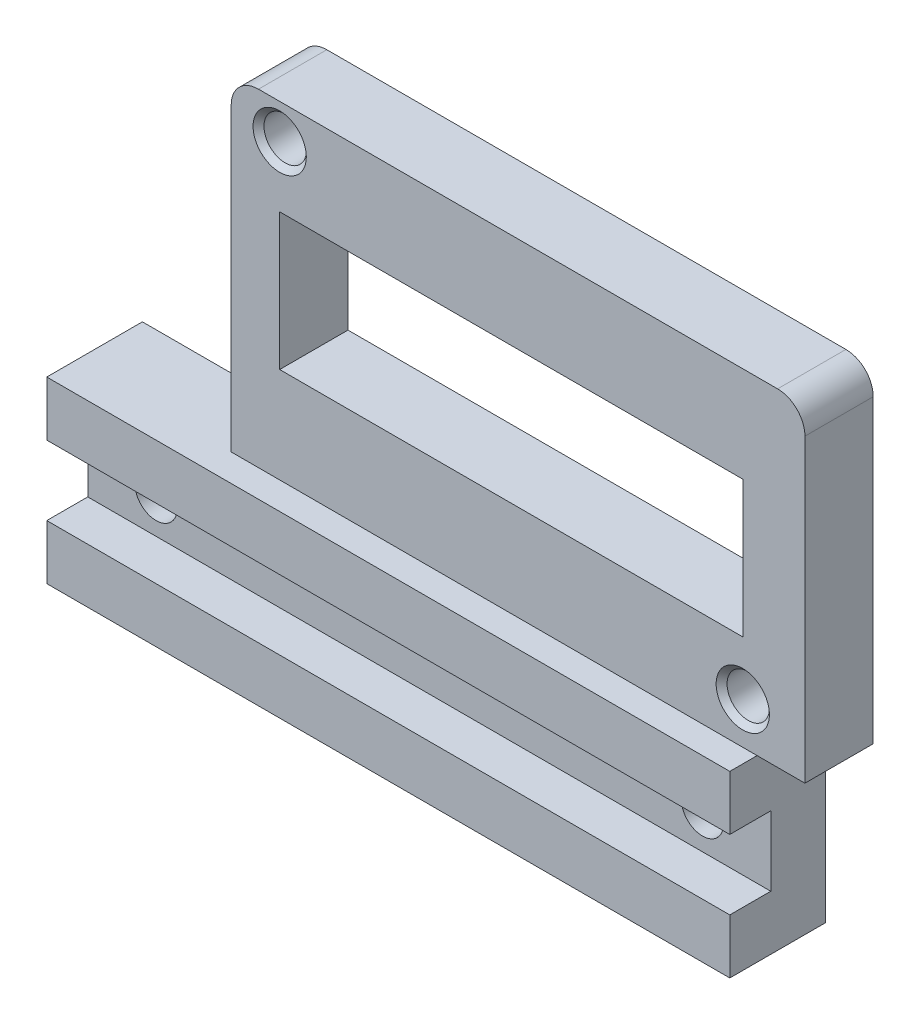
ISO-10303-21;
HEADER;
FILE_DESCRIPTION(('STEP AP214'),'2;1');
FILE_NAME('part.step','',(''),(''),'','','');
FILE_SCHEMA(('AUTOMOTIVE_DESIGN { 1 0 10303 214 1 1 1 1 }'));
ENDSEC;
DATA;
#1=APPLICATION_CONTEXT('core data for automotive mechanical design processes');
#2=APPLICATION_PROTOCOL_DEFINITION('international standard','automotive_design',2000,#1);
#3=PRODUCT_CONTEXT('',#1,'mechanical');
#4=PRODUCT('Part','Part','',(#3));
#5=PRODUCT_RELATED_PRODUCT_CATEGORY('part','',(#4));
#6=PRODUCT_DEFINITION_FORMATION('','',#4);
#7=PRODUCT_DEFINITION_CONTEXT('part definition',#1,'design');
#8=PRODUCT_DEFINITION('design','',#6,#7);
#9=PRODUCT_DEFINITION_SHAPE('','',#8);
#10=(LENGTH_UNIT() NAMED_UNIT(*) SI_UNIT(.MILLI.,.METRE.));
#11=(NAMED_UNIT(*) PLANE_ANGLE_UNIT() SI_UNIT($,.RADIAN.));
#12=(NAMED_UNIT(*) SI_UNIT($,.STERADIAN.) SOLID_ANGLE_UNIT());
#13=UNCERTAINTY_MEASURE_WITH_UNIT(LENGTH_MEASURE(1.E-05),#10,'distance_accuracy_value','');
#14=(GEOMETRIC_REPRESENTATION_CONTEXT(3) GLOBAL_UNCERTAINTY_ASSIGNED_CONTEXT((#13)) GLOBAL_UNIT_ASSIGNED_CONTEXT((#10,
#11,#12)) REPRESENTATION_CONTEXT('',''));
#15=CARTESIAN_POINT('',(0.,0.,0.));
#16=DIRECTION('',(0.,0.,1.));
#17=DIRECTION('',(1.,0.,0.));
#18=AXIS2_PLACEMENT_3D('',#15,#16,#17);
#19=CARTESIAN_POINT('',(-25.,6.55,7.));
#20=DIRECTION('',(0.,-1.,0.));
#21=DIRECTION('',(0.,0.,-1.));
#22=AXIS2_PLACEMENT_3D('',#19,#20,#21);
#23=PLANE('',#22);
#24=DIRECTION('',(1.,0.,0.));
#25=VECTOR('',#24,1.);
#26=CARTESIAN_POINT('',(0.,6.55,5.));
#27=LINE('',#26,#25);
#28=CARTESIAN_POINT('',(-13.5,6.55,5.));
#29=VERTEX_POINT('',#28);
#30=CARTESIAN_POINT('',(25.,6.55,5.));
#31=VERTEX_POINT('',#30);
#32=EDGE_CURVE('E300',#29,#31,#27,.T.);
#33=ORIENTED_EDGE('',*,*,#32,.F.);
#34=DIRECTION('',(0.,0.,-1.));
#35=VECTOR('',#34,1.);
#36=CARTESIAN_POINT('',(-13.5,6.55,5.));
#37=LINE('',#36,#35);
#38=CARTESIAN_POINT('',(-13.5,6.55,0.));
#39=VERTEX_POINT('',#38);
#40=EDGE_CURVE('E319',#29,#39,#37,.T.);
#41=ORIENTED_EDGE('',*,*,#40,.T.);
#42=DIRECTION('',(-1.,0.,0.));
#43=VECTOR('',#42,1.);
#44=CARTESIAN_POINT('',(-25.,6.55,0.));
#45=LINE('',#44,#43);
#46=CARTESIAN_POINT('',(-25.,6.55,0.));
#47=VERTEX_POINT('',#46);
#48=EDGE_CURVE('E332',#39,#47,#45,.T.);
#49=ORIENTED_EDGE('',*,*,#48,.T.);
#50=DIRECTION('',(0.,0.,-1.));
#51=VECTOR('',#50,1.);
#52=CARTESIAN_POINT('',(-25.,6.55,7.));
#53=LINE('',#52,#51);
#54=CARTESIAN_POINT('',(-25.,6.55,7.));
#55=VERTEX_POINT('',#54);
#56=EDGE_CURVE('E341',#55,#47,#53,.T.);
#57=ORIENTED_EDGE('',*,*,#56,.F.);
#58=DIRECTION('',(-1.,0.,0.));
#59=VECTOR('',#58,1.);
#60=CARTESIAN_POINT('',(-25.,6.55,7.));
#61=LINE('',#60,#59);
#62=CARTESIAN_POINT('',(25.,6.55,7.));
#63=VERTEX_POINT('',#62);
#64=EDGE_CURVE('E338',#63,#55,#61,.T.);
#65=ORIENTED_EDGE('',*,*,#64,.F.);
#66=DIRECTION('',(0.,0.,-1.));
#67=VECTOR('',#66,1.);
#68=CARTESIAN_POINT('',(25.,6.55,7.));
#69=LINE('',#68,#67);
#70=EDGE_CURVE('E349',#63,#31,#69,.T.);
#71=ORIENTED_EDGE('',*,*,#70,.T.);
#72=EDGE_LOOP('',(#33,#41,#49,#57,#65,#71));
#73=FACE_BOUND('',#72,.T.);
#74=ADVANCED_FACE('F103',(#73),#23,.F.);
#75=CARTESIAN_POINT('',(25.,0.,4.));
#76=DIRECTION('',(1.,0.,0.));
#77=DIRECTION('',(0.,0.,-1.));
#78=AXIS2_PLACEMENT_3D('',#75,#76,#77);
#79=PLANE('',#78);
#80=DIRECTION('',(0.,-1.,0.));
#81=VECTOR('',#80,1.);
#82=CARTESIAN_POINT('',(25.,0.,0.));
#83=LINE('',#82,#81);
#84=CARTESIAN_POINT('',(25.,6.55,0.));
#85=VERTEX_POINT('',#84);
#86=CARTESIAN_POINT('',(25.,-6.55,0.));
#87=VERTEX_POINT('',#86);
#88=EDGE_CURVE('E360',#85,#87,#83,.T.);
#89=ORIENTED_EDGE('',*,*,#88,.F.);
#90=EDGE_CURVE('E348',#31,#85,#69,.T.);
#91=ORIENTED_EDGE('',*,*,#90,.F.);
#92=ORIENTED_EDGE('',*,*,#70,.F.);
#93=DIRECTION('',(0.,1.,0.));
#94=VECTOR('',#93,1.);
#95=CARTESIAN_POINT('',(25.,2.55,7.));
#96=LINE('',#95,#94);
#97=CARTESIAN_POINT('',(25.,2.55,7.));
#98=VERTEX_POINT('',#97);
#99=EDGE_CURVE('E335',#98,#63,#96,.T.);
#100=ORIENTED_EDGE('',*,*,#99,.F.);
#101=DIRECTION('',(0.,0.,-1.));
#102=VECTOR('',#101,1.);
#103=CARTESIAN_POINT('',(25.,2.55,7.));
#104=LINE('',#103,#102);
#105=CARTESIAN_POINT('',(25.,2.55,4.));
#106=VERTEX_POINT('',#105);
#107=EDGE_CURVE('E353',#98,#106,#104,.T.);
#108=ORIENTED_EDGE('',*,*,#107,.T.);
#109=DIRECTION('',(0.,-1.,0.));
#110=VECTOR('',#109,1.);
#111=CARTESIAN_POINT('',(25.,0.,4.));
#112=LINE('',#111,#110);
#113=CARTESIAN_POINT('',(25.,-2.55,4.));
#114=VERTEX_POINT('',#113);
#115=EDGE_CURVE('E395',#106,#114,#112,.T.);
#116=ORIENTED_EDGE('',*,*,#115,.T.);
#117=DIRECTION('',(0.,0.,-1.));
#118=VECTOR('',#117,1.);
#119=CARTESIAN_POINT('',(25.,-2.55,7.));
#120=LINE('',#119,#118);
#121=CARTESIAN_POINT('',(25.,-2.55,7.));
#122=VERTEX_POINT('',#121);
#123=EDGE_CURVE('E368',#122,#114,#120,.T.);
#124=ORIENTED_EDGE('',*,*,#123,.F.);
#125=DIRECTION('',(0.,1.,0.));
#126=VECTOR('',#125,1.);
#127=CARTESIAN_POINT('',(25.,-2.55,7.));
#128=LINE('',#127,#126);
#129=CARTESIAN_POINT('',(25.,-6.55,7.));
#130=VERTEX_POINT('',#129);
#131=EDGE_CURVE('E382',#130,#122,#128,.T.);
#132=ORIENTED_EDGE('',*,*,#131,.F.);
#133=DIRECTION('',(0.,0.,-1.));
#134=VECTOR('',#133,1.);
#135=CARTESIAN_POINT('',(25.,-6.55,7.));
#136=LINE('',#135,#134);
#137=EDGE_CURVE('E364',#130,#87,#136,.T.);
#138=ORIENTED_EDGE('',*,*,#137,.T.);
#139=EDGE_LOOP('',(#89,#91,#92,#100,#108,#116,#124,#132,#138));
#140=FACE_BOUND('',#139,.T.);
#141=ADVANCED_FACE('F501',(#140),#79,.T.);
#142=CARTESIAN_POINT('',(-20.,0.,4.));
#143=DIRECTION('',(0.,0.,-1.));
#144=DIRECTION('',(-1.,0.,0.));
#145=AXIS2_PLACEMENT_3D('',#142,#143,#144);
#146=CYLINDRICAL_SURFACE('',#145,1.55);
#147=CARTESIAN_POINT('',(-20.,0.,4.));
#148=DIRECTION('',(0.,0.,1.));
#149=DIRECTION('',(1.,0.,0.));
#150=AXIS2_PLACEMENT_3D('',#147,#148,#149);
#151=CIRCLE('',#150,1.55);
#152=CARTESIAN_POINT('',(-18.45,0.,4.));
#153=VERTEX_POINT('',#152);
#154=EDGE_CURVE('E408',#153,#153,#151,.T.);
#155=ORIENTED_EDGE('',*,*,#154,.T.);
#156=EDGE_LOOP('',(#155));
#157=FACE_BOUND('',#156,.T.);
#158=CARTESIAN_POINT('',(-20.,0.,0.));
#159=DIRECTION('',(0.,0.,1.));
#160=DIRECTION('',(1.,0.,0.));
#161=AXIS2_PLACEMENT_3D('',#158,#159,#160);
#162=CIRCLE('',#161,1.55);
#163=CARTESIAN_POINT('',(-18.45,0.,0.));
#164=VERTEX_POINT('',#163);
#165=EDGE_CURVE('E422',#164,#164,#162,.T.);
#166=ORIENTED_EDGE('',*,*,#165,.F.);
#167=EDGE_LOOP('',(#166));
#168=FACE_BOUND('',#167,.T.);
#169=ADVANCED_FACE('F508',(#157,#168),#146,.F.);
#170=CARTESIAN_POINT('',(-25.,0.,4.));
#171=DIRECTION('',(1.,0.,0.));
#172=DIRECTION('',(0.,0.,-1.));
#173=AXIS2_PLACEMENT_3D('',#170,#171,#172);
#174=PLANE('',#173);
#175=DIRECTION('',(0.,-1.,0.));
#176=VECTOR('',#175,1.);
#177=CARTESIAN_POINT('',(-25.,0.,0.));
#178=LINE('',#177,#176);
#179=CARTESIAN_POINT('',(-25.,-6.55,0.));
#180=VERTEX_POINT('',#179);
#181=EDGE_CURVE('E419',#47,#180,#178,.T.);
#182=ORIENTED_EDGE('',*,*,#181,.T.);
#183=DIRECTION('',(0.,0.,-1.));
#184=VECTOR('',#183,1.);
#185=CARTESIAN_POINT('',(-25.,-6.55,7.));
#186=LINE('',#185,#184);
#187=CARTESIAN_POINT('',(-25.,-6.55,7.));
#188=VERTEX_POINT('',#187);
#189=EDGE_CURVE('E323',#188,#180,#186,.T.);
#190=ORIENTED_EDGE('',*,*,#189,.F.);
#191=DIRECTION('',(0.,-1.,0.));
#192=VECTOR('',#191,1.);
#193=CARTESIAN_POINT('',(-25.,-2.55,7.));
#194=LINE('',#193,#192);
#195=CARTESIAN_POINT('',(-25.,-2.55,7.));
#196=VERTEX_POINT('',#195);
#197=EDGE_CURVE('E379',#196,#188,#194,.T.);
#198=ORIENTED_EDGE('',*,*,#197,.F.);
#199=DIRECTION('',(0.,0.,-1.));
#200=VECTOR('',#199,1.);
#201=CARTESIAN_POINT('',(-25.,-2.55,7.));
#202=LINE('',#201,#200);
#203=CARTESIAN_POINT('',(-25.,-2.55,4.));
#204=VERTEX_POINT('',#203);
#205=EDGE_CURVE('E371',#196,#204,#202,.T.);
#206=ORIENTED_EDGE('',*,*,#205,.T.);
#207=DIRECTION('',(0.,-1.,0.));
#208=VECTOR('',#207,1.);
#209=CARTESIAN_POINT('',(-25.,0.,4.));
#210=LINE('',#209,#208);
#211=CARTESIAN_POINT('',(-25.,2.55,4.));
#212=VERTEX_POINT('',#211);
#213=EDGE_CURVE('E404',#212,#204,#210,.T.);
#214=ORIENTED_EDGE('',*,*,#213,.F.);
#215=DIRECTION('',(0.,0.,-1.));
#216=VECTOR('',#215,1.);
#217=CARTESIAN_POINT('',(-25.,2.55,7.));
#218=LINE('',#217,#216);
#219=CARTESIAN_POINT('',(-25.,2.55,7.));
#220=VERTEX_POINT('',#219);
#221=EDGE_CURVE('E357',#220,#212,#218,.T.);
#222=ORIENTED_EDGE('',*,*,#221,.F.);
#223=DIRECTION('',(0.,-1.,0.));
#224=VECTOR('',#223,1.);
#225=CARTESIAN_POINT('',(-25.,2.55,7.));
#226=LINE('',#225,#224);
#227=EDGE_CURVE('E327',#55,#220,#226,.T.);
#228=ORIENTED_EDGE('',*,*,#227,.F.);
#229=ORIENTED_EDGE('',*,*,#56,.T.);
#230=EDGE_LOOP('',(#182,#190,#198,#206,#214,#222,#228,#229));
#231=FACE_BOUND('',#230,.T.);
#232=ADVANCED_FACE('F542',(#231),#174,.F.);
#233=CARTESIAN_POINT('',(20.,0.,4.));
#234=DIRECTION('',(0.,0.,-1.));
#235=DIRECTION('',(-1.,0.,0.));
#236=AXIS2_PLACEMENT_3D('',#233,#234,#235);
#237=CYLINDRICAL_SURFACE('',#236,1.55);
#238=CARTESIAN_POINT('',(20.,0.,4.));
#239=DIRECTION('',(0.,0.,1.));
#240=DIRECTION('',(1.,0.,0.));
#241=AXIS2_PLACEMENT_3D('',#238,#239,#240);
#242=CIRCLE('',#241,1.55);
#243=CARTESIAN_POINT('',(21.55,0.,4.));
#244=VERTEX_POINT('',#243);
#245=EDGE_CURVE('E412',#244,#244,#242,.T.);
#246=ORIENTED_EDGE('',*,*,#245,.T.);
#247=EDGE_LOOP('',(#246));
#248=FACE_BOUND('',#247,.T.);
#249=CARTESIAN_POINT('',(20.,0.,0.));
#250=DIRECTION('',(0.,0.,1.));
#251=DIRECTION('',(1.,0.,0.));
#252=AXIS2_PLACEMENT_3D('',#249,#250,#251);
#253=CIRCLE('',#252,1.55);
#254=CARTESIAN_POINT('',(21.55,0.,0.));
#255=VERTEX_POINT('',#254);
#256=EDGE_CURVE('E396',#255,#255,#253,.T.);
#257=ORIENTED_EDGE('',*,*,#256,.F.);
#258=EDGE_LOOP('',(#257));
#259=FACE_BOUND('',#258,.T.);
#260=ADVANCED_FACE('F535',(#248,#259),#237,.F.);
#261=CARTESIAN_POINT('',(0.,0.,4.));
#262=DIRECTION('',(0.,0.,1.));
#263=DIRECTION('',(1.,0.,0.));
#264=AXIS2_PLACEMENT_3D('',#261,#262,#263);
#265=PLANE('',#264);
#266=DIRECTION('',(1.,0.,0.));
#267=VECTOR('',#266,1.);
#268=CARTESIAN_POINT('',(0.,-2.55,4.));
#269=LINE('',#268,#267);
#270=EDGE_CURVE('E391',#204,#114,#269,.T.);
#271=ORIENTED_EDGE('',*,*,#270,.T.);
#272=ORIENTED_EDGE('',*,*,#115,.F.);
#273=DIRECTION('',(-1.,0.,0.));
#274=VECTOR('',#273,1.);
#275=CARTESIAN_POINT('',(0.,2.55,4.));
#276=LINE('',#275,#274);
#277=EDGE_CURVE('E400',#106,#212,#276,.T.);
#278=ORIENTED_EDGE('',*,*,#277,.T.);
#279=ORIENTED_EDGE('',*,*,#213,.T.);
#280=EDGE_LOOP('',(#271,#272,#278,#279));
#281=FACE_BOUND('',#280,.T.);
#282=ORIENTED_EDGE('',*,*,#154,.F.);
#283=EDGE_LOOP('',(#282));
#284=FACE_BOUND('',#283,.T.);
#285=ORIENTED_EDGE('',*,*,#245,.F.);
#286=EDGE_LOOP('',(#285));
#287=FACE_BOUND('',#286,.T.);
#288=ADVANCED_FACE('F532',(#281,#284,#287),#265,.T.);
#289=CARTESIAN_POINT('',(0.,0.,0.));
#290=DIRECTION('',(0.,0.,1.));
#291=DIRECTION('',(1.,0.,0.));
#292=AXIS2_PLACEMENT_3D('',#289,#290,#291);
#293=PLANE('',#292);
#294=DIRECTION('',(0.,-1.,0.));
#295=VECTOR('',#294,1.);
#296=CARTESIAN_POINT('',(-13.5,0.,0.));
#297=LINE('',#296,#295);
#298=CARTESIAN_POINT('',(-13.5,28.55,0.));
#299=VERTEX_POINT('',#298);
#300=EDGE_CURVE('E296',#299,#39,#297,.T.);
#301=ORIENTED_EDGE('',*,*,#300,.F.);
#302=CARTESIAN_POINT('',(-11.5,28.55,0.));
#303=DIRECTION('',(0.,0.,1.));
#304=DIRECTION('',(1.,0.,0.));
#305=AXIS2_PLACEMENT_3D('',#302,#303,#304);
#306=CIRCLE('',#305,2.);
#307=CARTESIAN_POINT('',(-11.5,30.55,0.));
#308=VERTEX_POINT('',#307);
#309=EDGE_CURVE('E435',#299,#308,#306,.F.);
#310=ORIENTED_EDGE('',*,*,#309,.T.);
#311=DIRECTION('',(1.,0.,0.));
#312=VECTOR('',#311,1.);
#313=CARTESIAN_POINT('',(0.,30.55,0.));
#314=LINE('',#313,#312);
#315=CARTESIAN_POINT('',(26.5,30.55,0.));
#316=VERTEX_POINT('',#315);
#317=EDGE_CURVE('E257',#308,#316,#314,.T.);
#318=ORIENTED_EDGE('',*,*,#317,.T.);
#319=CARTESIAN_POINT('',(26.5,28.55,0.));
#320=DIRECTION('',(0.,0.,1.));
#321=DIRECTION('',(1.,0.,0.));
#322=AXIS2_PLACEMENT_3D('',#319,#320,#321);
#323=CIRCLE('',#322,2.);
#324=CARTESIAN_POINT('',(28.5,28.55,0.));
#325=VERTEX_POINT('',#324);
#326=EDGE_CURVE('E432',#316,#325,#323,.F.);
#327=ORIENTED_EDGE('',*,*,#326,.T.);
#328=DIRECTION('',(0.,1.,0.));
#329=VECTOR('',#328,1.);
#330=CARTESIAN_POINT('',(28.5,0.,0.));
#331=LINE('',#330,#329);
#332=CARTESIAN_POINT('',(28.5,6.55,0.));
#333=VERTEX_POINT('',#332);
#334=EDGE_CURVE('E311',#333,#325,#331,.T.);
#335=ORIENTED_EDGE('',*,*,#334,.F.);
#336=DIRECTION('',(1.,0.,0.));
#337=VECTOR('',#336,1.);
#338=CARTESIAN_POINT('',(0.,6.55,0.));
#339=LINE('',#338,#337);
#340=EDGE_CURVE('E314',#85,#333,#339,.T.);
#341=ORIENTED_EDGE('',*,*,#340,.F.);
#342=ORIENTED_EDGE('',*,*,#88,.T.);
#343=DIRECTION('',(1.,0.,0.));
#344=VECTOR('',#343,1.);
#345=CARTESIAN_POINT('',(-25.,-6.55,0.));
#346=LINE('',#345,#344);
#347=EDGE_CURVE('E344',#180,#87,#346,.T.);
#348=ORIENTED_EDGE('',*,*,#347,.F.);
#349=ORIENTED_EDGE('',*,*,#181,.F.);
#350=ORIENTED_EDGE('',*,*,#48,.F.);
#351=EDGE_LOOP('',(#301,#310,#318,#327,#335,#341,#342,#348,#349,#350));
#352=FACE_BOUND('',#351,.T.);
#353=ORIENTED_EDGE('',*,*,#165,.T.);
#354=EDGE_LOOP('',(#353));
#355=FACE_BOUND('',#354,.T.);
#356=ORIENTED_EDGE('',*,*,#256,.T.);
#357=EDGE_LOOP('',(#356));
#358=FACE_BOUND('',#357,.T.);
#359=DIRECTION('',(0.,-1.,0.));
#360=VECTOR('',#359,1.);
#361=CARTESIAN_POINT('',(-9.95,0.,0.));
#362=LINE('',#361,#360);
#363=CARTESIAN_POINT('',(-9.95,23.55,0.));
#364=VERTEX_POINT('',#363);
#365=CARTESIAN_POINT('',(-9.95,13.55,0.));
#366=VERTEX_POINT('',#365);
#367=EDGE_CURVE('E272',#364,#366,#362,.T.);
#368=ORIENTED_EDGE('',*,*,#367,.T.);
#369=DIRECTION('',(1.,0.,0.));
#370=VECTOR('',#369,1.);
#371=CARTESIAN_POINT('',(0.,13.55,0.));
#372=LINE('',#371,#370);
#373=CARTESIAN_POINT('',(23.95,13.55,0.));
#374=VERTEX_POINT('',#373);
#375=EDGE_CURVE('E255',#366,#374,#372,.T.);
#376=ORIENTED_EDGE('',*,*,#375,.T.);
#377=DIRECTION('',(0.,-1.,0.));
#378=VECTOR('',#377,1.);
#379=CARTESIAN_POINT('',(23.95,0.,0.));
#380=LINE('',#379,#378);
#381=CARTESIAN_POINT('',(23.95,23.55,0.));
#382=VERTEX_POINT('',#381);
#383=EDGE_CURVE('E278',#382,#374,#380,.T.);
#384=ORIENTED_EDGE('',*,*,#383,.F.);
#385=DIRECTION('',(1.,0.,0.));
#386=VECTOR('',#385,1.);
#387=CARTESIAN_POINT('',(0.,23.55,0.));
#388=LINE('',#387,#386);
#389=EDGE_CURVE('E249',#364,#382,#388,.T.);
#390=ORIENTED_EDGE('',*,*,#389,.F.);
#391=EDGE_LOOP('',(#368,#376,#384,#390));
#392=FACE_BOUND('',#391,.T.);
#393=CARTESIAN_POINT('',(-9.95,28.,0.));
#394=DIRECTION('',(0.,0.,1.));
#395=DIRECTION('',(1.,0.,0.));
#396=AXIS2_PLACEMENT_3D('',#393,#394,#395);
#397=CIRCLE('',#396,1.55);
#398=CARTESIAN_POINT('',(-8.4,28.,0.));
#399=VERTEX_POINT('',#398);
#400=EDGE_CURVE('E275',#399,#399,#397,.T.);
#401=ORIENTED_EDGE('',*,*,#400,.T.);
#402=EDGE_LOOP('',(#401));
#403=FACE_BOUND('',#402,.T.);
#404=CARTESIAN_POINT('',(23.95,9.6,0.));
#405=DIRECTION('',(0.,0.,1.));
#406=DIRECTION('',(1.,0.,0.));
#407=AXIS2_PLACEMENT_3D('',#404,#405,#406);
#408=CIRCLE('',#407,1.55);
#409=CARTESIAN_POINT('',(25.5,9.6,0.));
#410=VERTEX_POINT('',#409);
#411=EDGE_CURVE('E479',#410,#410,#408,.T.);
#412=ORIENTED_EDGE('',*,*,#411,.T.);
#413=EDGE_LOOP('',(#412));
#414=FACE_BOUND('',#413,.T.);
#415=ADVANCED_FACE('F487',(#352,#355,#358,#392,#403,#414),#293,.F.);
#416=CARTESIAN_POINT('',(-25.,2.55,7.));
#417=DIRECTION('',(0.,1.,0.));
#418=DIRECTION('',(0.,0.,1.));
#419=AXIS2_PLACEMENT_3D('',#416,#417,#418);
#420=PLANE('',#419);
#421=ORIENTED_EDGE('',*,*,#277,.F.);
#422=ORIENTED_EDGE('',*,*,#107,.F.);
#423=DIRECTION('',(1.,0.,0.));
#424=VECTOR('',#423,1.);
#425=CARTESIAN_POINT('',(-25.,2.55,7.));
#426=LINE('',#425,#424);
#427=EDGE_CURVE('E331',#220,#98,#426,.T.);
#428=ORIENTED_EDGE('',*,*,#427,.F.);
#429=ORIENTED_EDGE('',*,*,#221,.T.);
#430=EDGE_LOOP('',(#421,#422,#428,#429));
#431=FACE_BOUND('',#430,.T.);
#432=ADVANCED_FACE('F516',(#431),#420,.F.);
#433=CARTESIAN_POINT('',(0.,0.,7.));
#434=DIRECTION('',(0.,0.,-1.));
#435=DIRECTION('',(-1.,0.,0.));
#436=AXIS2_PLACEMENT_3D('',#433,#434,#435);
#437=PLANE('',#436);
#438=ORIENTED_EDGE('',*,*,#227,.T.);
#439=ORIENTED_EDGE('',*,*,#427,.T.);
#440=ORIENTED_EDGE('',*,*,#99,.T.);
#441=ORIENTED_EDGE('',*,*,#64,.T.);
#442=EDGE_LOOP('',(#438,#439,#440,#441));
#443=FACE_BOUND('',#442,.T.);
#444=ADVANCED_FACE('F514',(#443),#437,.F.);
#445=CARTESIAN_POINT('',(-25.,-6.55,7.));
#446=DIRECTION('',(0.,1.,0.));
#447=DIRECTION('',(0.,0.,1.));
#448=AXIS2_PLACEMENT_3D('',#445,#446,#447);
#449=PLANE('',#448);
#450=ORIENTED_EDGE('',*,*,#347,.T.);
#451=ORIENTED_EDGE('',*,*,#137,.F.);
#452=DIRECTION('',(1.,0.,0.));
#453=VECTOR('',#452,1.);
#454=CARTESIAN_POINT('',(-25.,-6.55,7.));
#455=LINE('',#454,#453);
#456=EDGE_CURVE('E385',#188,#130,#455,.T.);
#457=ORIENTED_EDGE('',*,*,#456,.F.);
#458=ORIENTED_EDGE('',*,*,#189,.T.);
#459=EDGE_LOOP('',(#450,#451,#457,#458));
#460=FACE_BOUND('',#459,.T.);
#461=ADVANCED_FACE('F520',(#460),#449,.F.);
#462=CARTESIAN_POINT('',(-25.,-2.55,7.));
#463=DIRECTION('',(0.,-1.,0.));
#464=DIRECTION('',(0.,0.,-1.));
#465=AXIS2_PLACEMENT_3D('',#462,#463,#464);
#466=PLANE('',#465);
#467=ORIENTED_EDGE('',*,*,#270,.F.);
#468=ORIENTED_EDGE('',*,*,#205,.F.);
#469=DIRECTION('',(-1.,0.,0.));
#470=VECTOR('',#469,1.);
#471=CARTESIAN_POINT('',(-25.,-2.55,7.));
#472=LINE('',#471,#470);
#473=EDGE_CURVE('E375',#122,#196,#472,.T.);
#474=ORIENTED_EDGE('',*,*,#473,.F.);
#475=ORIENTED_EDGE('',*,*,#123,.T.);
#476=EDGE_LOOP('',(#467,#468,#474,#475));
#477=FACE_BOUND('',#476,.T.);
#478=ADVANCED_FACE('F523',(#477),#466,.F.);
#479=CARTESIAN_POINT('',(0.,0.,7.));
#480=DIRECTION('',(0.,0.,1.));
#481=DIRECTION('',(1.,0.,0.));
#482=AXIS2_PLACEMENT_3D('',#479,#480,#481);
#483=PLANE('',#482);
#484=ORIENTED_EDGE('',*,*,#197,.T.);
#485=ORIENTED_EDGE('',*,*,#456,.T.);
#486=ORIENTED_EDGE('',*,*,#131,.T.);
#487=ORIENTED_EDGE('',*,*,#473,.T.);
#488=EDGE_LOOP('',(#484,#485,#486,#487));
#489=FACE_BOUND('',#488,.T.);
#490=ADVANCED_FACE('F527',(#489),#483,.T.);
#491=CARTESIAN_POINT('',(0.,6.55,5.));
#492=DIRECTION('',(0.,1.,0.));
#493=DIRECTION('',(0.,0.,1.));
#494=AXIS2_PLACEMENT_3D('',#491,#492,#493);
#495=PLANE('',#494);
#496=CARTESIAN_POINT('',(28.5,6.55,5.));
#497=VERTEX_POINT('',#496);
#498=EDGE_CURVE('E299',#31,#497,#27,.T.);
#499=ORIENTED_EDGE('',*,*,#498,.F.);
#500=ORIENTED_EDGE('',*,*,#90,.T.);
#501=ORIENTED_EDGE('',*,*,#340,.T.);
#502=DIRECTION('',(0.,0.,-1.));
#503=VECTOR('',#502,1.);
#504=CARTESIAN_POINT('',(28.5,6.55,5.));
#505=LINE('',#504,#503);
#506=EDGE_CURVE('E307',#497,#333,#505,.T.);
#507=ORIENTED_EDGE('',*,*,#506,.F.);
#508=EDGE_LOOP('',(#499,#500,#501,#507));
#509=FACE_BOUND('',#508,.T.);
#510=ADVANCED_FACE('F530',(#509),#495,.F.);
#511=CARTESIAN_POINT('',(0.,0.,5.));
#512=DIRECTION('',(0.,0.,1.));
#513=DIRECTION('',(1.,0.,0.));
#514=AXIS2_PLACEMENT_3D('',#511,#512,#513);
#515=PLANE('',#514);
#516=CARTESIAN_POINT('',(23.95,9.6,5.));
#517=DIRECTION('',(0.,0.,1.));
#518=DIRECTION('',(1.,0.,0.));
#519=AXIS2_PLACEMENT_3D('',#516,#517,#518);
#520=CIRCLE('',#519,1.94999999999999);
#521=CARTESIAN_POINT('',(25.9,9.6,5.));
#522=VERTEX_POINT('',#521);
#523=EDGE_CURVE('E113',#522,#522,#520,.F.);
#524=ORIENTED_EDGE('',*,*,#523,.T.);
#525=EDGE_LOOP('',(#524));
#526=FACE_BOUND('',#525,.T.);
#527=CARTESIAN_POINT('',(-9.95,28.,5.));
#528=DIRECTION('',(0.,0.,1.));
#529=DIRECTION('',(1.,0.,0.));
#530=AXIS2_PLACEMENT_3D('',#527,#528,#529);
#531=CIRCLE('',#530,1.94999999999999);
#532=CARTESIAN_POINT('',(-8.,28.,5.));
#533=VERTEX_POINT('',#532);
#534=EDGE_CURVE('E456',#533,#533,#531,.F.);
#535=ORIENTED_EDGE('',*,*,#534,.T.);
#536=EDGE_LOOP('',(#535));
#537=FACE_BOUND('',#536,.T.);
#538=DIRECTION('',(1.,0.,0.));
#539=VECTOR('',#538,1.);
#540=CARTESIAN_POINT('',(0.,30.55,5.));
#541=LINE('',#540,#539);
#542=CARTESIAN_POINT('',(-11.5,30.55,5.));
#543=VERTEX_POINT('',#542);
#544=CARTESIAN_POINT('',(26.5,30.55,5.));
#545=VERTEX_POINT('',#544);
#546=EDGE_CURVE('E292',#543,#545,#541,.T.);
#547=ORIENTED_EDGE('',*,*,#546,.F.);
#548=CARTESIAN_POINT('',(-11.5,28.55,5.));
#549=DIRECTION('',(0.,0.,1.));
#550=DIRECTION('',(1.,0.,0.));
#551=AXIS2_PLACEMENT_3D('',#548,#549,#550);
#552=CIRCLE('',#551,2.);
#553=CARTESIAN_POINT('',(-13.5,28.55,5.));
#554=VERTEX_POINT('',#553);
#555=EDGE_CURVE('E447',#543,#554,#552,.T.);
#556=ORIENTED_EDGE('',*,*,#555,.T.);
#557=DIRECTION('',(0.,-1.,0.));
#558=VECTOR('',#557,1.);
#559=CARTESIAN_POINT('',(-13.5,0.,5.));
#560=LINE('',#559,#558);
#561=EDGE_CURVE('E304',#554,#29,#560,.T.);
#562=ORIENTED_EDGE('',*,*,#561,.T.);
#563=ORIENTED_EDGE('',*,*,#32,.T.);
#564=ORIENTED_EDGE('',*,*,#498,.T.);
#565=DIRECTION('',(0.,1.,0.));
#566=VECTOR('',#565,1.);
#567=CARTESIAN_POINT('',(28.5,0.,5.));
#568=LINE('',#567,#566);
#569=CARTESIAN_POINT('',(28.5,28.55,5.));
#570=VERTEX_POINT('',#569);
#571=EDGE_CURVE('E295',#497,#570,#568,.T.);
#572=ORIENTED_EDGE('',*,*,#571,.T.);
#573=CARTESIAN_POINT('',(26.5,28.55,5.));
#574=DIRECTION('',(0.,0.,1.));
#575=DIRECTION('',(1.,0.,0.));
#576=AXIS2_PLACEMENT_3D('',#573,#574,#575);
#577=CIRCLE('',#576,2.);
#578=EDGE_CURVE('E127',#570,#545,#577,.T.);
#579=ORIENTED_EDGE('',*,*,#578,.T.);
#580=EDGE_LOOP('',(#547,#556,#562,#563,#564,#572,#579));
#581=FACE_BOUND('',#580,.T.);
#582=DIRECTION('',(1.,0.,0.));
#583=VECTOR('',#582,1.);
#584=CARTESIAN_POINT('',(0.,13.55,5.));
#585=LINE('',#584,#583);
#586=CARTESIAN_POINT('',(-9.95,13.55,5.));
#587=VERTEX_POINT('',#586);
#588=CARTESIAN_POINT('',(23.95,13.55,5.));
#589=VERTEX_POINT('',#588);
#590=EDGE_CURVE('E248',#587,#589,#585,.T.);
#591=ORIENTED_EDGE('',*,*,#590,.F.);
#592=DIRECTION('',(0.,-1.,0.));
#593=VECTOR('',#592,1.);
#594=CARTESIAN_POINT('',(-9.95,0.,5.));
#595=LINE('',#594,#593);
#596=CARTESIAN_POINT('',(-9.95,23.55,5.));
#597=VERTEX_POINT('',#596);
#598=EDGE_CURVE('E236',#597,#587,#595,.T.);
#599=ORIENTED_EDGE('',*,*,#598,.F.);
#600=DIRECTION('',(1.,0.,0.));
#601=VECTOR('',#600,1.);
#602=CARTESIAN_POINT('',(0.,23.55,5.));
#603=LINE('',#602,#601);
#604=CARTESIAN_POINT('',(23.95,23.55,5.));
#605=VERTEX_POINT('',#604);
#606=EDGE_CURVE('E266',#597,#605,#603,.T.);
#607=ORIENTED_EDGE('',*,*,#606,.T.);
#608=DIRECTION('',(0.,-1.,0.));
#609=VECTOR('',#608,1.);
#610=CARTESIAN_POINT('',(23.95,0.,5.));
#611=LINE('',#610,#609);
#612=EDGE_CURVE('E262',#605,#589,#611,.T.);
#613=ORIENTED_EDGE('',*,*,#612,.T.);
#614=EDGE_LOOP('',(#591,#599,#607,#613));
#615=FACE_BOUND('',#614,.T.);
#616=ADVANCED_FACE('F261',(#526,#537,#581,#615),#515,.T.);
#617=CARTESIAN_POINT('',(0.,30.55,5.));
#618=DIRECTION('',(0.,1.,0.));
#619=DIRECTION('',(0.,0.,1.));
#620=AXIS2_PLACEMENT_3D('',#617,#618,#619);
#621=PLANE('',#620);
#622=ORIENTED_EDGE('',*,*,#317,.F.);
#623=DIRECTION('',(0.,0.,-1.));
#624=VECTOR('',#623,1.);
#625=CARTESIAN_POINT('',(-11.5,30.55,5.));
#626=LINE('',#625,#624);
#627=EDGE_CURVE('E442',#308,#543,#626,.F.);
#628=ORIENTED_EDGE('',*,*,#627,.T.);
#629=ORIENTED_EDGE('',*,*,#546,.T.);
#630=DIRECTION('',(0.,0.,-1.));
#631=VECTOR('',#630,1.);
#632=CARTESIAN_POINT('',(26.5,30.55,0.));
#633=LINE('',#632,#631);
#634=EDGE_CURVE('E438',#545,#316,#633,.T.);
#635=ORIENTED_EDGE('',*,*,#634,.T.);
#636=EDGE_LOOP('',(#622,#628,#629,#635));
#637=FACE_BOUND('',#636,.T.);
#638=ADVANCED_FACE('F565',(#637),#621,.T.);
#639=CARTESIAN_POINT('',(-13.5,0.,5.));
#640=DIRECTION('',(1.,0.,0.));
#641=DIRECTION('',(0.,1.,0.));
#642=AXIS2_PLACEMENT_3D('',#639,#640,#641);
#643=PLANE('',#642);
#644=ORIENTED_EDGE('',*,*,#561,.F.);
#645=DIRECTION('',(0.,0.,-1.));
#646=VECTOR('',#645,1.);
#647=CARTESIAN_POINT('',(-13.5,28.55,0.));
#648=LINE('',#647,#646);
#649=EDGE_CURVE('E416',#554,#299,#648,.T.);
#650=ORIENTED_EDGE('',*,*,#649,.T.);
#651=ORIENTED_EDGE('',*,*,#300,.T.);
#652=ORIENTED_EDGE('',*,*,#40,.F.);
#653=EDGE_LOOP('',(#644,#650,#651,#652));
#654=FACE_BOUND('',#653,.T.);
#655=ADVANCED_FACE('F575',(#654),#643,.F.);
#656=CARTESIAN_POINT('',(28.5,0.,5.));
#657=DIRECTION('',(-1.,0.,0.));
#658=DIRECTION('',(0.,0.,1.));
#659=AXIS2_PLACEMENT_3D('',#656,#657,#658);
#660=PLANE('',#659);
#661=ORIENTED_EDGE('',*,*,#334,.T.);
#662=DIRECTION('',(0.,0.,-1.));
#663=VECTOR('',#662,1.);
#664=CARTESIAN_POINT('',(28.5,28.55,5.));
#665=LINE('',#664,#663);
#666=EDGE_CURVE('E120',#325,#570,#665,.F.);
#667=ORIENTED_EDGE('',*,*,#666,.T.);
#668=ORIENTED_EDGE('',*,*,#571,.F.);
#669=ORIENTED_EDGE('',*,*,#506,.T.);
#670=EDGE_LOOP('',(#661,#667,#668,#669));
#671=FACE_BOUND('',#670,.T.);
#672=ADVANCED_FACE('F603',(#671),#660,.F.);
#673=CARTESIAN_POINT('',(-9.95,0.,5.));
#674=DIRECTION('',(1.,0.,0.));
#675=DIRECTION('',(0.,1.,0.));
#676=AXIS2_PLACEMENT_3D('',#673,#674,#675);
#677=PLANE('',#676);
#678=ORIENTED_EDGE('',*,*,#367,.F.);
#679=DIRECTION('',(0.,0.,-1.));
#680=VECTOR('',#679,1.);
#681=CARTESIAN_POINT('',(-9.95,23.55,5.));
#682=LINE('',#681,#680);
#683=EDGE_CURVE('E242',#597,#364,#682,.T.);
#684=ORIENTED_EDGE('',*,*,#683,.F.);
#685=ORIENTED_EDGE('',*,*,#598,.T.);
#686=DIRECTION('',(0.,0.,-1.));
#687=VECTOR('',#686,1.);
#688=CARTESIAN_POINT('',(-9.95,13.55,5.));
#689=LINE('',#688,#687);
#690=EDGE_CURVE('E239',#587,#366,#689,.T.);
#691=ORIENTED_EDGE('',*,*,#690,.T.);
#692=EDGE_LOOP('',(#678,#684,#685,#691));
#693=FACE_BOUND('',#692,.T.);
#694=ADVANCED_FACE('F238',(#693),#677,.T.);
#695=CARTESIAN_POINT('',(0.,13.55,5.));
#696=DIRECTION('',(0.,1.,0.));
#697=DIRECTION('',(0.,0.,1.));
#698=AXIS2_PLACEMENT_3D('',#695,#696,#697);
#699=PLANE('',#698);
#700=ORIENTED_EDGE('',*,*,#375,.F.);
#701=ORIENTED_EDGE('',*,*,#690,.F.);
#702=ORIENTED_EDGE('',*,*,#590,.T.);
#703=DIRECTION('',(0.,0.,-1.));
#704=VECTOR('',#703,1.);
#705=CARTESIAN_POINT('',(23.95,13.55,5.));
#706=LINE('',#705,#704);
#707=EDGE_CURVE('E258',#589,#374,#706,.T.);
#708=ORIENTED_EDGE('',*,*,#707,.T.);
#709=EDGE_LOOP('',(#700,#701,#702,#708));
#710=FACE_BOUND('',#709,.T.);
#711=ADVANCED_FACE('F252',(#710),#699,.T.);
#712=CARTESIAN_POINT('',(23.95,0.,5.));
#713=DIRECTION('',(1.,0.,0.));
#714=DIRECTION('',(0.,0.,-1.));
#715=AXIS2_PLACEMENT_3D('',#712,#713,#714);
#716=PLANE('',#715);
#717=ORIENTED_EDGE('',*,*,#383,.T.);
#718=ORIENTED_EDGE('',*,*,#707,.F.);
#719=ORIENTED_EDGE('',*,*,#612,.F.);
#720=DIRECTION('',(0.,0.,-1.));
#721=VECTOR('',#720,1.);
#722=CARTESIAN_POINT('',(23.95,23.55,5.));
#723=LINE('',#722,#721);
#724=EDGE_CURVE('E287',#605,#382,#723,.T.);
#725=ORIENTED_EDGE('',*,*,#724,.T.);
#726=EDGE_LOOP('',(#717,#718,#719,#725));
#727=FACE_BOUND('',#726,.T.);
#728=ADVANCED_FACE('F497',(#727),#716,.F.);
#729=CARTESIAN_POINT('',(0.,23.55,5.));
#730=DIRECTION('',(0.,1.,0.));
#731=DIRECTION('',(0.,0.,1.));
#732=AXIS2_PLACEMENT_3D('',#729,#730,#731);
#733=PLANE('',#732);
#734=ORIENTED_EDGE('',*,*,#389,.T.);
#735=ORIENTED_EDGE('',*,*,#724,.F.);
#736=ORIENTED_EDGE('',*,*,#606,.F.);
#737=ORIENTED_EDGE('',*,*,#683,.T.);
#738=EDGE_LOOP('',(#734,#735,#736,#737));
#739=FACE_BOUND('',#738,.T.);
#740=ADVANCED_FACE('F490',(#739),#733,.F.);
#741=CARTESIAN_POINT('',(-9.95,28.,5.));
#742=DIRECTION('',(0.,0.,-1.));
#743=DIRECTION('',(-1.,0.,0.));
#744=AXIS2_PLACEMENT_3D('',#741,#742,#743);
#745=CYLINDRICAL_SURFACE('',#744,1.55);
#746=CARTESIAN_POINT('',(-9.95,28.,4.60000000000001));
#747=DIRECTION('',(0.,0.,1.));
#748=DIRECTION('',(1.,0.,0.));
#749=AXIS2_PLACEMENT_3D('',#746,#747,#748);
#750=CIRCLE('',#749,1.55);
#751=CARTESIAN_POINT('',(-8.4,28.,4.60000000000001));
#752=VERTEX_POINT('',#751);
#753=EDGE_CURVE('E12',#752,#752,#750,.T.);
#754=ORIENTED_EDGE('',*,*,#753,.T.);
#755=EDGE_LOOP('',(#754));
#756=FACE_BOUND('',#755,.T.);
#757=ORIENTED_EDGE('',*,*,#400,.F.);
#758=EDGE_LOOP('',(#757));
#759=FACE_BOUND('',#758,.T.);
#760=ADVANCED_FACE('F475',(#756,#759),#745,.F.);
#761=CARTESIAN_POINT('',(23.95,9.6,5.));
#762=DIRECTION('',(0.,0.,-1.));
#763=DIRECTION('',(-1.,0.,0.));
#764=AXIS2_PLACEMENT_3D('',#761,#762,#763);
#765=CYLINDRICAL_SURFACE('',#764,1.55);
#766=CARTESIAN_POINT('',(23.95,9.6,4.60000000000001));
#767=DIRECTION('',(0.,0.,1.));
#768=DIRECTION('',(1.,0.,0.));
#769=AXIS2_PLACEMENT_3D('',#766,#767,#768);
#770=CIRCLE('',#769,1.55);
#771=CARTESIAN_POINT('',(25.5,9.6,4.60000000000001));
#772=VERTEX_POINT('',#771);
#773=EDGE_CURVE('E452',#772,#772,#770,.T.);
#774=ORIENTED_EDGE('',*,*,#773,.T.);
#775=EDGE_LOOP('',(#774));
#776=FACE_BOUND('',#775,.T.);
#777=ORIENTED_EDGE('',*,*,#411,.F.);
#778=EDGE_LOOP('',(#777));
#779=FACE_BOUND('',#778,.T.);
#780=ADVANCED_FACE('F471',(#776,#779),#765,.F.);
#781=CARTESIAN_POINT('',(-11.5,28.55,5.));
#782=DIRECTION('',(0.,0.,1.));
#783=DIRECTION('',(1.,0.,0.));
#784=AXIS2_PLACEMENT_3D('',#781,#782,#783);
#785=CYLINDRICAL_SURFACE('',#784,2.);
#786=ORIENTED_EDGE('',*,*,#555,.F.);
#787=ORIENTED_EDGE('',*,*,#627,.F.);
#788=ORIENTED_EDGE('',*,*,#309,.F.);
#789=ORIENTED_EDGE('',*,*,#649,.F.);
#790=EDGE_LOOP('',(#786,#787,#788,#789));
#791=FACE_BOUND('',#790,.T.);
#792=ADVANCED_FACE('F474',(#791),#785,.T.);
#793=CARTESIAN_POINT('',(26.5,28.55,5.));
#794=DIRECTION('',(0.,0.,1.));
#795=DIRECTION('',(1.,0.,0.));
#796=AXIS2_PLACEMENT_3D('',#793,#794,#795);
#797=CYLINDRICAL_SURFACE('',#796,2.);
#798=ORIENTED_EDGE('',*,*,#578,.F.);
#799=ORIENTED_EDGE('',*,*,#666,.F.);
#800=ORIENTED_EDGE('',*,*,#326,.F.);
#801=ORIENTED_EDGE('',*,*,#634,.F.);
#802=EDGE_LOOP('',(#798,#799,#800,#801));
#803=FACE_BOUND('',#802,.T.);
#804=ADVANCED_FACE('F468',(#803),#797,.T.);
#805=CARTESIAN_POINT('',(23.95,9.6,4.60000000000001));
#806=DIRECTION('',(0.,0.,1.));
#807=DIRECTION('',(1.,0.,0.));
#808=AXIS2_PLACEMENT_3D('',#805,#806,#807);
#809=CONICAL_SURFACE('',#808,1.55,0.785398163397455);
#810=ORIENTED_EDGE('',*,*,#523,.F.);
#811=EDGE_LOOP('',(#810));
#812=FACE_BOUND('',#811,.T.);
#813=ORIENTED_EDGE('',*,*,#773,.F.);
#814=EDGE_LOOP('',(#813));
#815=FACE_BOUND('',#814,.T.);
#816=ADVANCED_FACE('F465',(#812,#815),#809,.F.);
#817=CARTESIAN_POINT('',(-9.95,28.,4.60000000000001));
#818=DIRECTION('',(0.,0.,1.));
#819=DIRECTION('',(1.,0.,0.));
#820=AXIS2_PLACEMENT_3D('',#817,#818,#819);
#821=CONICAL_SURFACE('',#820,1.55,0.785398163397455);
#822=CARTESIAN_POINT('',(-8.,28.,5.));
#823=CARTESIAN_POINT('',(-8.00416666666667,28.,4.99583333333333));
#824=CARTESIAN_POINT('',(-8.00833333333334,28.,4.99166666666667));
#825=CARTESIAN_POINT('',(-8.01666666666667,28.,4.98333333333333));
#826=CARTESIAN_POINT('',(-8.02083333333334,28.,4.97916666666667));
#827=CARTESIAN_POINT('',(-8.02916666666667,28.,4.97083333333333));
#828=CARTESIAN_POINT('',(-8.03333333333334,28.,4.96666666666667));
#829=CARTESIAN_POINT('',(-8.04166666666667,28.,4.95833333333333));
#830=CARTESIAN_POINT('',(-8.04583333333334,28.,4.95416666666667));
#831=CARTESIAN_POINT('',(-8.05416666666667,28.,4.94583333333333));
#832=CARTESIAN_POINT('',(-8.05833333333334,28.,4.94166666666667));
#833=CARTESIAN_POINT('',(-8.06666666666667,28.,4.93333333333334));
#834=CARTESIAN_POINT('',(-8.07083333333334,28.,4.92916666666667));
#835=CARTESIAN_POINT('',(-8.07916666666667,28.,4.92083333333334));
#836=CARTESIAN_POINT('',(-8.08333333333334,28.,4.91666666666667));
#837=CARTESIAN_POINT('',(-8.09166666666667,28.,4.90833333333334));
#838=CARTESIAN_POINT('',(-8.09583333333334,28.,4.90416666666667));
#839=CARTESIAN_POINT('',(-8.10416666666667,28.,4.89583333333334));
#840=CARTESIAN_POINT('',(-8.10833333333334,28.,4.89166666666667));
#841=CARTESIAN_POINT('',(-8.11666666666667,28.,4.88333333333334));
#842=CARTESIAN_POINT('',(-8.12083333333334,28.,4.87916666666667));
#843=CARTESIAN_POINT('',(-8.12916666666667,28.,4.87083333333334));
#844=CARTESIAN_POINT('',(-8.13333333333333,28.,4.86666666666667));
#845=CARTESIAN_POINT('',(-8.14166666666667,28.,4.85833333333334));
#846=CARTESIAN_POINT('',(-8.14583333333333,28.,4.85416666666667));
#847=CARTESIAN_POINT('',(-8.15416666666667,28.,4.84583333333334));
#848=CARTESIAN_POINT('',(-8.15833333333333,28.,4.84166666666667));
#849=CARTESIAN_POINT('',(-8.16666666666667,28.,4.83333333333334));
#850=CARTESIAN_POINT('',(-8.17083333333334,28.,4.82916666666667));
#851=CARTESIAN_POINT('',(-8.17916666666667,28.,4.82083333333334));
#852=CARTESIAN_POINT('',(-8.18333333333333,28.,4.81666666666667));
#853=CARTESIAN_POINT('',(-8.19166666666667,28.,4.80833333333334));
#854=CARTESIAN_POINT('',(-8.19583333333333,28.,4.80416666666667));
#855=CARTESIAN_POINT('',(-8.20416666666667,28.,4.79583333333334));
#856=CARTESIAN_POINT('',(-8.20833333333333,28.,4.79166666666667));
#857=CARTESIAN_POINT('',(-8.21666666666667,28.,4.78333333333334));
#858=CARTESIAN_POINT('',(-8.22083333333333,28.,4.77916666666667));
#859=CARTESIAN_POINT('',(-8.22916666666667,28.,4.77083333333334));
#860=CARTESIAN_POINT('',(-8.23333333333333,28.,4.76666666666667));
#861=CARTESIAN_POINT('',(-8.24166666666667,28.,4.75833333333334));
#862=CARTESIAN_POINT('',(-8.24583333333333,28.,4.75416666666667));
#863=CARTESIAN_POINT('',(-8.25416666666666,28.,4.74583333333334));
#864=CARTESIAN_POINT('',(-8.25833333333333,28.,4.74166666666667));
#865=CARTESIAN_POINT('',(-8.26666666666667,28.,4.73333333333334));
#866=CARTESIAN_POINT('',(-8.27083333333333,28.,4.72916666666668));
#867=CARTESIAN_POINT('',(-8.27916666666667,28.,4.72083333333334));
#868=CARTESIAN_POINT('',(-8.28333333333333,28.,4.71666666666668));
#869=CARTESIAN_POINT('',(-8.29166666666666,28.,4.70833333333334));
#870=CARTESIAN_POINT('',(-8.29583333333333,28.,4.70416666666668));
#871=CARTESIAN_POINT('',(-8.30416666666667,28.,4.69583333333334));
#872=CARTESIAN_POINT('',(-8.30833333333333,28.,4.69166666666668));
#873=CARTESIAN_POINT('',(-8.31666666666666,28.,4.68333333333334));
#874=CARTESIAN_POINT('',(-8.32083333333333,28.,4.67916666666668));
#875=CARTESIAN_POINT('',(-8.32916666666666,28.,4.67083333333334));
#876=CARTESIAN_POINT('',(-8.33333333333333,28.,4.66666666666668));
#877=CARTESIAN_POINT('',(-8.34166666666666,28.,4.65833333333334));
#878=CARTESIAN_POINT('',(-8.34583333333333,28.,4.65416666666668));
#879=CARTESIAN_POINT('',(-8.35416666666666,28.,4.64583333333334));
#880=CARTESIAN_POINT('',(-8.35833333333333,28.,4.64166666666668));
#881=CARTESIAN_POINT('',(-8.36666666666666,28.,4.63333333333334));
#882=CARTESIAN_POINT('',(-8.37083333333333,28.,4.62916666666668));
#883=CARTESIAN_POINT('',(-8.37916666666666,28.,4.62083333333335));
#884=CARTESIAN_POINT('',(-8.38333333333333,28.,4.61666666666668));
#885=CARTESIAN_POINT('',(-8.39166666666666,28.,4.60833333333335));
#886=CARTESIAN_POINT('',(-8.39583333333333,28.,4.60416666666668));
#887=CARTESIAN_POINT('',(-8.4,28.,4.60000000000001));
#888=B_SPLINE_CURVE_WITH_KNOTS('',3,(#822,#823,#824,#825,#826,#827,#828,#829,#830,#831,#832,
#833,#834,#835,#836,#837,#838,#839,#840,#841,#842,#843,#844,#845,#846,#847,#848,#849,#850,#851,
#852,#853,#854,#855,#856,#857,#858,#859,#860,#861,#862,#863,#864,#865,#866,#867,#868,#869,#870,
#871,#872,#873,#874,#875,#876,#877,#878,#879,#880,#881,#882,#883,#884,#885,#886,#887),
.UNSPECIFIED.,.F.,.F.,(4,2,2,2,2,2,2,2,2,2,2,2,2,2,2,2,2,2,2,2,2,2,2,2,2,2,2,2,2,2,2,2,4),(0.,
0.0176776695296642,0.0353553390593278,0.0530330085889901,0.0707106781186537,0.0883883476483173,
0.10606601717798,0.123743686707643,0.141421356237307,0.15909902576697,0.176776695296633,
0.194454364826296,0.212132034355959,0.229809703885623,0.247487373415286,0.265165042944949,
0.282842712474612,0.300520382004275,0.318198051533939,0.335875721063603,0.353553390593265,
0.371231060122929,0.388908729652592,0.406586399182254,0.424264068711919,0.441941738241582,
0.459619407771245,0.477297077300908,0.494974746830572,0.512652416360234,0.530330085889898,
0.548007755419561,0.565685424949224),.UNSPECIFIED.);
#889=EDGE_CURVE('BSEAM106',#533,#752,#888,.T.);
#890=ORIENTED_EDGE('',*,*,#534,.F.);
#891=ORIENTED_EDGE('',*,*,#753,.F.);
#892=ORIENTED_EDGE('',*,*,#889,.T.);
#893=ORIENTED_EDGE('',*,*,#889,.F.);
#894=EDGE_LOOP('',(#890,#892,#891,#893));
#895=FACE_BOUND('',#894,.T.);
#896=ADVANCED_FACE('F106',(#895),#821,.F.);
#897=CLOSED_SHELL('',(#74,#141,#169,#232,#260,#288,#415,#432,#444,#461,#478,#490,#510,#616,#638,
#655,#672,#694,#711,#728,#740,#760,#780,#792,#804,#816,#896));
#898=MANIFOLD_SOLID_BREP('B2',#897);
#899=ADVANCED_BREP_SHAPE_REPRESENTATION('',(#18,#898),#14);
#900=SHAPE_DEFINITION_REPRESENTATION(#9,#899);
ENDSEC;
END-ISO-10303-21;
